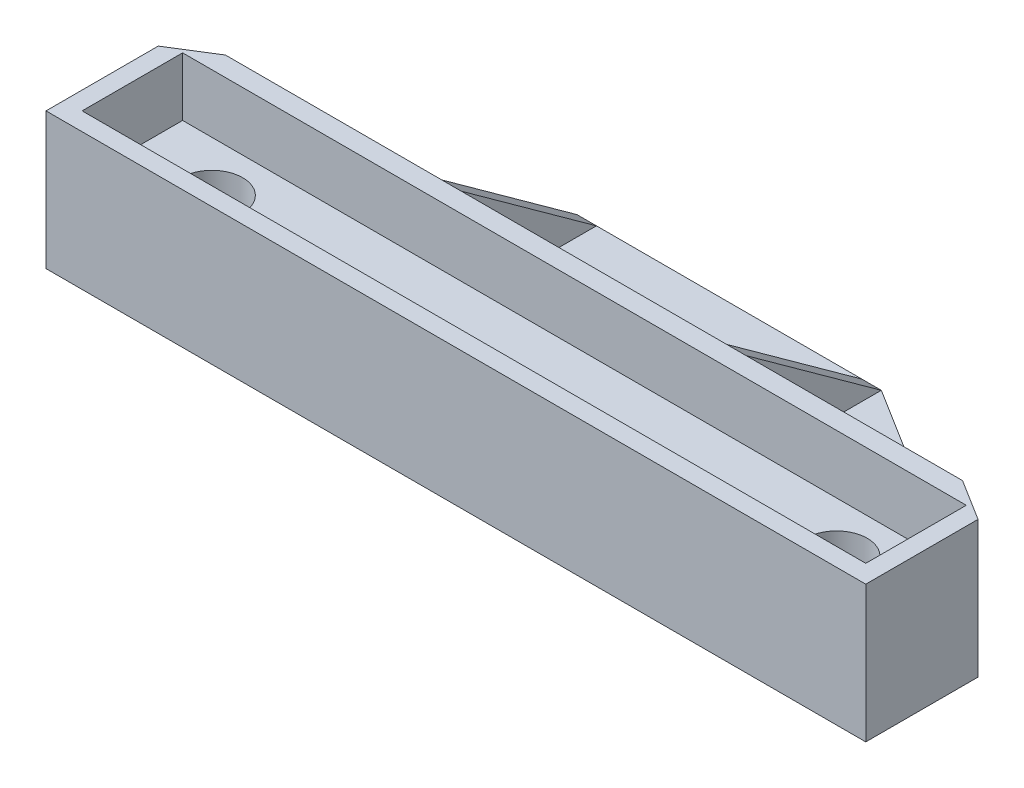
ISO-10303-21;
HEADER;
FILE_DESCRIPTION(('STEP AP214'),'2;1');
FILE_NAME('part.step','',(''),(''),'','','');
FILE_SCHEMA(('AUTOMOTIVE_DESIGN { 1 0 10303 214 1 1 1 1 }'));
ENDSEC;
DATA;
#1=APPLICATION_CONTEXT('core data for automotive mechanical design processes');
#2=APPLICATION_PROTOCOL_DEFINITION('international standard','automotive_design',2000,#1);
#3=PRODUCT_CONTEXT('',#1,'mechanical');
#4=PRODUCT('Part','Part','',(#3));
#5=PRODUCT_RELATED_PRODUCT_CATEGORY('part','',(#4));
#6=PRODUCT_DEFINITION_FORMATION('','',#4);
#7=PRODUCT_DEFINITION_CONTEXT('part definition',#1,'design');
#8=PRODUCT_DEFINITION('design','',#6,#7);
#9=PRODUCT_DEFINITION_SHAPE('','',#8);
#10=(LENGTH_UNIT() NAMED_UNIT(*) SI_UNIT(.MILLI.,.METRE.));
#11=(NAMED_UNIT(*) PLANE_ANGLE_UNIT() SI_UNIT($,.RADIAN.));
#12=(NAMED_UNIT(*) SI_UNIT($,.STERADIAN.) SOLID_ANGLE_UNIT());
#13=UNCERTAINTY_MEASURE_WITH_UNIT(LENGTH_MEASURE(1.E-05),#10,'distance_accuracy_value','');
#14=(GEOMETRIC_REPRESENTATION_CONTEXT(3) GLOBAL_UNCERTAINTY_ASSIGNED_CONTEXT((#13)) GLOBAL_UNIT_ASSIGNED_CONTEXT((#10,
#11,#12)) REPRESENTATION_CONTEXT('',''));
#15=CARTESIAN_POINT('',(0.,0.,0.));
#16=DIRECTION('',(0.,0.,1.));
#17=DIRECTION('',(1.,0.,0.));
#18=AXIS2_PLACEMENT_3D('',#15,#16,#17);
#19=CARTESIAN_POINT('',(-16.,7.,-3.49999999993634));
#20=DIRECTION('',(0.,-1.,0.));
#21=DIRECTION('',(0.,0.,-1.));
#22=AXIS2_PLACEMENT_3D('',#19,#20,#21);
#23=CYLINDRICAL_SURFACE('',#22,1.575);
#24=CARTESIAN_POINT('',(-16.,0.,-3.49999999993634));
#25=DIRECTION('',(0.,-1.,0.));
#26=DIRECTION('',(0.,0.,1.));
#27=AXIS2_PLACEMENT_3D('',#24,#25,#26);
#28=CIRCLE('',#27,1.575);
#29=CARTESIAN_POINT('',(-16.,0.,-1.92499999993634));
#30=VERTEX_POINT('',#29);
#31=EDGE_CURVE('E293',#30,#30,#28,.T.);
#32=ORIENTED_EDGE('',*,*,#31,.T.);
#33=EDGE_LOOP('',(#32));
#34=FACE_BOUND('',#33,.T.);
#35=CARTESIAN_POINT('',(-16.,4.,-3.49999999993634));
#36=DIRECTION('',(0.,1.,0.));
#37=DIRECTION('',(0.,0.,1.));
#38=AXIS2_PLACEMENT_3D('',#35,#36,#37);
#39=CIRCLE('',#38,1.575);
#40=CARTESIAN_POINT('',(-16.,4.,-1.92499999993634));
#41=VERTEX_POINT('',#40);
#42=EDGE_CURVE('E289',#41,#41,#39,.F.);
#43=ORIENTED_EDGE('',*,*,#42,.F.);
#44=EDGE_LOOP('',(#43));
#45=FACE_BOUND('',#44,.T.);
#46=ADVANCED_FACE('F45',(#34,#45),#23,.F.);
#47=CARTESIAN_POINT('',(16.,7.,-3.49999999993633));
#48=DIRECTION('',(0.,-1.,0.));
#49=DIRECTION('',(0.,0.,-1.));
#50=AXIS2_PLACEMENT_3D('',#47,#48,#49);
#51=CYLINDRICAL_SURFACE('',#50,1.575);
#52=CARTESIAN_POINT('',(16.,0.,-3.49999999993633));
#53=DIRECTION('',(0.,-1.,0.));
#54=DIRECTION('',(0.,0.,-1.));
#55=AXIS2_PLACEMENT_3D('',#52,#53,#54);
#56=CIRCLE('',#55,1.575);
#57=CARTESIAN_POINT('',(16.,0.,-5.07499999993633));
#58=VERTEX_POINT('',#57);
#59=EDGE_CURVE('E294',#58,#58,#56,.T.);
#60=ORIENTED_EDGE('',*,*,#59,.T.);
#61=EDGE_LOOP('',(#60));
#62=FACE_BOUND('',#61,.T.);
#63=CARTESIAN_POINT('',(16.,4.,-3.49999999993633));
#64=DIRECTION('',(0.,1.,0.));
#65=DIRECTION('',(0.,0.,1.));
#66=AXIS2_PLACEMENT_3D('',#63,#64,#65);
#67=CIRCLE('',#66,1.575);
#68=CARTESIAN_POINT('',(16.,4.,-1.92499999993633));
#69=VERTEX_POINT('',#68);
#70=EDGE_CURVE('E279',#69,#69,#67,.F.);
#71=ORIENTED_EDGE('',*,*,#70,.F.);
#72=EDGE_LOOP('',(#71));
#73=FACE_BOUND('',#72,.T.);
#74=ADVANCED_FACE('F403',(#62,#73),#51,.F.);
#75=CARTESIAN_POINT('',(21.,7.,-5.75));
#76=DIRECTION('',(-1.,0.,0.));
#77=DIRECTION('',(0.,0.,1.));
#78=AXIS2_PLACEMENT_3D('',#75,#76,#77);
#79=PLANE('',#78);
#80=DIRECTION('',(0.,0.,-1.));
#81=VECTOR('',#80,1.);
#82=CARTESIAN_POINT('',(21.,0.,-5.75));
#83=LINE('',#82,#81);
#84=CARTESIAN_POINT('',(21.,0.,0.));
#85=VERTEX_POINT('',#84);
#86=CARTESIAN_POINT('',(21.,0.,-5.75));
#87=VERTEX_POINT('',#86);
#88=EDGE_CURVE('E298',#85,#87,#83,.T.);
#89=ORIENTED_EDGE('',*,*,#88,.T.);
#90=DIRECTION('',(0.,-1.,0.));
#91=VECTOR('',#90,1.);
#92=CARTESIAN_POINT('',(21.,7.,-5.75));
#93=LINE('',#92,#91);
#94=CARTESIAN_POINT('',(21.,7.,-5.75));
#95=VERTEX_POINT('',#94);
#96=EDGE_CURVE('E345',#95,#87,#93,.T.);
#97=ORIENTED_EDGE('',*,*,#96,.F.);
#98=DIRECTION('',(0.,0.,-1.));
#99=VECTOR('',#98,1.);
#100=CARTESIAN_POINT('',(21.,7.,-5.75));
#101=LINE('',#100,#99);
#102=CARTESIAN_POINT('',(21.,7.,0.));
#103=VERTEX_POINT('',#102);
#104=EDGE_CURVE('E302',#103,#95,#101,.T.);
#105=ORIENTED_EDGE('',*,*,#104,.F.);
#106=DIRECTION('',(0.,-1.,0.));
#107=VECTOR('',#106,1.);
#108=CARTESIAN_POINT('',(21.,7.,0.));
#109=LINE('',#108,#107);
#110=EDGE_CURVE('E320',#103,#85,#109,.T.);
#111=ORIENTED_EDGE('',*,*,#110,.T.);
#112=EDGE_LOOP('',(#89,#97,#105,#111));
#113=FACE_BOUND('',#112,.T.);
#114=ADVANCED_FACE('F409',(#113),#79,.F.);
#115=CARTESIAN_POINT('',(21.,7.,-5.75));
#116=DIRECTION('',(-0.529919264233528,0.,0.848048096156224));
#117=DIRECTION('',(0.848048096156224,0.,0.529919264233528));
#118=AXIS2_PLACEMENT_3D('',#115,#116,#117);
#119=PLANE('',#118);
#120=DIRECTION('',(-0.848048096156395,0.,-0.529919264233254));
#121=VECTOR('',#120,1.);
#122=CARTESIAN_POINT('',(7.79724013561682,2.,-13.9999999998727));
#123=LINE('',#122,#121);
#124=CARTESIAN_POINT('',(17.2792222201838,2.,-8.07499999987266));
#125=VERTEX_POINT('',#124);
#126=CARTESIAN_POINT('',(7.79724013561682,2.,-13.9999999998727));
#127=VERTEX_POINT('',#126);
#128=EDGE_CURVE('E184',#125,#127,#123,.T.);
#129=ORIENTED_EDGE('',*,*,#128,.F.);
#130=DIRECTION('',(-0.749337346632538,-0.468237942152119,-0.468237942152125));
#131=VECTOR('',#130,1.);
#132=CARTESIAN_POINT('',(21.9385723739609,4.91148511091008,-5.16351488896254));
#133=LINE('',#132,#131);
#134=CARTESIAN_POINT('',(18.8795567492247,2.99999999999999,-7.07499999987266));
#135=VERTEX_POINT('',#134);
#136=EDGE_CURVE('E55',#125,#135,#133,.F.);
#137=ORIENTED_EDGE('',*,*,#136,.T.);
#138=DIRECTION('',(0.,1.,0.));
#139=VECTOR('',#138,1.);
#140=CARTESIAN_POINT('',(18.8795567492247,2.,-7.07499999987266));
#141=LINE('',#140,#139);
#142=CARTESIAN_POINT('',(18.8795567492247,7.,-7.07499999987266));
#143=VERTEX_POINT('',#142);
#144=EDGE_CURVE('E232',#135,#143,#141,.T.);
#145=ORIENTED_EDGE('',*,*,#144,.T.);
#146=DIRECTION('',(-0.848048096156224,0.,-0.529919264233528));
#147=VECTOR('',#146,1.);
#148=CARTESIAN_POINT('',(21.,7.,-5.75));
#149=LINE('',#148,#147);
#150=EDGE_CURVE('E306',#95,#143,#149,.T.);
#151=ORIENTED_EDGE('',*,*,#150,.F.);
#152=ORIENTED_EDGE('',*,*,#96,.T.);
#153=DIRECTION('',(-0.848048096156224,0.,-0.529919264233528));
#154=VECTOR('',#153,1.);
#155=CARTESIAN_POINT('',(21.,0.,-5.75));
#156=LINE('',#155,#154);
#157=CARTESIAN_POINT('',(7.79724013561683,0.,-13.9999999998727));
#158=VERTEX_POINT('',#157);
#159=EDGE_CURVE('E236',#87,#158,#156,.T.);
#160=ORIENTED_EDGE('',*,*,#159,.T.);
#161=DIRECTION('',(0.,-1.,0.));
#162=VECTOR('',#161,1.);
#163=CARTESIAN_POINT('',(7.79724013561683,7.,-13.9999999998727));
#164=LINE('',#163,#162);
#165=EDGE_CURVE('E219',#127,#158,#164,.T.);
#166=ORIENTED_EDGE('',*,*,#165,.F.);
#167=EDGE_LOOP('',(#129,#137,#145,#151,#152,#160,#166));
#168=FACE_BOUND('',#167,.T.);
#169=ADVANCED_FACE('F234',(#168),#119,.F.);
#170=CARTESIAN_POINT('',(-21.,7.,-5.75));
#171=DIRECTION('',(0.529919264233528,0.,0.848048096156224));
#172=DIRECTION('',(0.848048096156224,0.,-0.529919264233528));
#173=AXIS2_PLACEMENT_3D('',#170,#171,#172);
#174=PLANE('',#173);
#175=DIRECTION('',(-0.848048096156224,0.,0.529919264233528));
#176=VECTOR('',#175,1.);
#177=CARTESIAN_POINT('',(-21.,7.,-5.75));
#178=LINE('',#177,#176);
#179=CARTESIAN_POINT('',(-18.8795567492247,7.,-7.07499999987266));
#180=VERTEX_POINT('',#179);
#181=CARTESIAN_POINT('',(-21.,7.,-5.75));
#182=VERTEX_POINT('',#181);
#183=EDGE_CURVE('E311',#180,#182,#178,.T.);
#184=ORIENTED_EDGE('',*,*,#183,.F.);
#185=DIRECTION('',(0.,1.,0.));
#186=VECTOR('',#185,1.);
#187=CARTESIAN_POINT('',(-18.8795567492247,2.,-7.07499999987266));
#188=LINE('',#187,#186);
#189=CARTESIAN_POINT('',(-18.8795567492247,2.99999999999999,-7.07499999987266));
#190=VERTEX_POINT('',#189);
#191=EDGE_CURVE('E490',#190,#180,#188,.T.);
#192=ORIENTED_EDGE('',*,*,#191,.F.);
#193=DIRECTION('',(-0.749337346632538,0.468237942152119,0.468237942152125));
#194=VECTOR('',#193,1.);
#195=CARTESIAN_POINT('',(-21.9385723739609,4.91148511091008,-5.16351488896254));
#196=LINE('',#195,#194);
#197=CARTESIAN_POINT('',(-17.2792222201838,2.,-8.07499999987266));
#198=VERTEX_POINT('',#197);
#199=EDGE_CURVE('E11',#190,#198,#196,.F.);
#200=ORIENTED_EDGE('',*,*,#199,.T.);
#201=DIRECTION('',(-0.848048096156395,0.,0.529919264233254));
#202=VECTOR('',#201,1.);
#203=CARTESIAN_POINT('',(-7.79724013561682,2.,-13.9999999998727));
#204=LINE('',#203,#202);
#205=CARTESIAN_POINT('',(-7.79724013561682,2.,-13.9999999998727));
#206=VERTEX_POINT('',#205);
#207=EDGE_CURVE('E483',#206,#198,#204,.T.);
#208=ORIENTED_EDGE('',*,*,#207,.F.);
#209=DIRECTION('',(0.,-1.,0.));
#210=VECTOR('',#209,1.);
#211=CARTESIAN_POINT('',(-7.79724013561683,7.,-13.9999999998727));
#212=LINE('',#211,#210);
#213=CARTESIAN_POINT('',(-7.79724013561683,0.,-13.9999999998727));
#214=VERTEX_POINT('',#213);
#215=EDGE_CURVE('E240',#206,#214,#212,.T.);
#216=ORIENTED_EDGE('',*,*,#215,.T.);
#217=DIRECTION('',(-0.848048096156224,0.,0.529919264233528));
#218=VECTOR('',#217,1.);
#219=CARTESIAN_POINT('',(-21.,0.,-5.75));
#220=LINE('',#219,#218);
#221=CARTESIAN_POINT('',(-21.,0.,-5.75));
#222=VERTEX_POINT('',#221);
#223=EDGE_CURVE('E326',#214,#222,#220,.T.);
#224=ORIENTED_EDGE('',*,*,#223,.T.);
#225=DIRECTION('',(0.,-1.,0.));
#226=VECTOR('',#225,1.);
#227=CARTESIAN_POINT('',(-21.,7.,-5.75));
#228=LINE('',#227,#226);
#229=EDGE_CURVE('E341',#182,#222,#228,.T.);
#230=ORIENTED_EDGE('',*,*,#229,.F.);
#231=EDGE_LOOP('',(#184,#192,#200,#208,#216,#224,#230));
#232=FACE_BOUND('',#231,.T.);
#233=ADVANCED_FACE('F431',(#232),#174,.F.);
#234=CARTESIAN_POINT('',(-21.,7.,-5.75));
#235=DIRECTION('',(1.,0.,0.));
#236=DIRECTION('',(0.,0.,-1.));
#237=AXIS2_PLACEMENT_3D('',#234,#235,#236);
#238=PLANE('',#237);
#239=DIRECTION('',(0.,0.,1.));
#240=VECTOR('',#239,1.);
#241=CARTESIAN_POINT('',(-21.,0.,-5.75));
#242=LINE('',#241,#240);
#243=CARTESIAN_POINT('',(-21.,0.,0.));
#244=VERTEX_POINT('',#243);
#245=EDGE_CURVE('E329',#222,#244,#242,.T.);
#246=ORIENTED_EDGE('',*,*,#245,.T.);
#247=DIRECTION('',(0.,-1.,0.));
#248=VECTOR('',#247,1.);
#249=CARTESIAN_POINT('',(-21.,7.,0.));
#250=LINE('',#249,#248);
#251=CARTESIAN_POINT('',(-21.,7.,0.));
#252=VERTEX_POINT('',#251);
#253=EDGE_CURVE('E337',#252,#244,#250,.T.);
#254=ORIENTED_EDGE('',*,*,#253,.F.);
#255=DIRECTION('',(0.,0.,1.));
#256=VECTOR('',#255,1.);
#257=CARTESIAN_POINT('',(-21.,7.,-5.75));
#258=LINE('',#257,#256);
#259=EDGE_CURVE('E314',#182,#252,#258,.T.);
#260=ORIENTED_EDGE('',*,*,#259,.F.);
#261=ORIENTED_EDGE('',*,*,#229,.T.);
#262=EDGE_LOOP('',(#246,#254,#260,#261));
#263=FACE_BOUND('',#262,.T.);
#264=ADVANCED_FACE('F427',(#263),#238,.F.);
#265=CARTESIAN_POINT('',(-21.,7.,0.));
#266=DIRECTION('',(0.,0.,-1.));
#267=DIRECTION('',(-1.,0.,0.));
#268=AXIS2_PLACEMENT_3D('',#265,#266,#267);
#269=PLANE('',#268);
#270=DIRECTION('',(1.,0.,0.));
#271=VECTOR('',#270,1.);
#272=CARTESIAN_POINT('',(-21.,0.,0.));
#273=LINE('',#272,#271);
#274=EDGE_CURVE('E307',#244,#85,#273,.T.);
#275=ORIENTED_EDGE('',*,*,#274,.T.);
#276=ORIENTED_EDGE('',*,*,#110,.F.);
#277=DIRECTION('',(1.,0.,0.));
#278=VECTOR('',#277,1.);
#279=CARTESIAN_POINT('',(-21.,7.,0.));
#280=LINE('',#279,#278);
#281=EDGE_CURVE('E317',#252,#103,#280,.T.);
#282=ORIENTED_EDGE('',*,*,#281,.F.);
#283=ORIENTED_EDGE('',*,*,#253,.T.);
#284=EDGE_LOOP('',(#275,#276,#282,#283));
#285=FACE_BOUND('',#284,.T.);
#286=ADVANCED_FACE('F419',(#285),#269,.F.);
#287=CARTESIAN_POINT('',(0.,7.,0.));
#288=DIRECTION('',(0.,1.,0.));
#289=DIRECTION('',(0.,0.,1.));
#290=AXIS2_PLACEMENT_3D('',#287,#288,#289);
#291=PLANE('',#290);
#292=DIRECTION('',(-1.,0.,0.));
#293=VECTOR('',#292,1.);
#294=CARTESIAN_POINT('',(21.,7.,-7.07499999987266));
#295=LINE('',#294,#293);
#296=CARTESIAN_POINT('',(-6.79724013561682,7.,-7.07499999987266));
#297=VERTEX_POINT('',#296);
#298=CARTESIAN_POINT('',(-7.79724013561682,7.,-7.07499999987266));
#299=VERTEX_POINT('',#298);
#300=EDGE_CURVE('E225',#297,#299,#295,.T.);
#301=ORIENTED_EDGE('',*,*,#300,.T.);
#302=DIRECTION('',(1.,0.,0.));
#303=VECTOR('',#302,1.);
#304=CARTESIAN_POINT('',(-18.8795567492247,7.,-7.07499999987266));
#305=LINE('',#304,#303);
#306=EDGE_CURVE('E469',#180,#299,#305,.T.);
#307=ORIENTED_EDGE('',*,*,#306,.F.);
#308=ORIENTED_EDGE('',*,*,#183,.T.);
#309=ORIENTED_EDGE('',*,*,#259,.T.);
#310=ORIENTED_EDGE('',*,*,#281,.T.);
#311=ORIENTED_EDGE('',*,*,#104,.T.);
#312=ORIENTED_EDGE('',*,*,#150,.T.);
#313=DIRECTION('',(1.,0.,0.));
#314=VECTOR('',#313,1.);
#315=CARTESIAN_POINT('',(18.8795567492247,7.,-7.07499999987266));
#316=LINE('',#315,#314);
#317=CARTESIAN_POINT('',(7.79724013561682,7.,-7.07499999987266));
#318=VERTEX_POINT('',#317);
#319=EDGE_CURVE('E194',#318,#143,#316,.T.);
#320=ORIENTED_EDGE('',*,*,#319,.F.);
#321=CARTESIAN_POINT('',(6.79724013561682,7.,-7.07499999987266));
#322=VERTEX_POINT('',#321);
#323=EDGE_CURVE('E207',#318,#322,#295,.T.);
#324=ORIENTED_EDGE('',*,*,#323,.T.);
#325=DIRECTION('',(1.,0.,0.));
#326=VECTOR('',#325,1.);
#327=CARTESIAN_POINT('',(6.79724013561682,7.,-7.07499999987266));
#328=LINE('',#327,#326);
#329=EDGE_CURVE('E464',#297,#322,#328,.T.);
#330=ORIENTED_EDGE('',*,*,#329,.F.);
#331=EDGE_LOOP('',(#301,#307,#308,#309,#310,#311,#312,#320,#324,#330));
#332=FACE_BOUND('',#331,.T.);
#333=DIRECTION('',(0.,0.,1.));
#334=VECTOR('',#333,1.);
#335=CARTESIAN_POINT('',(-20.075,7.,-6.07499999987266));
#336=LINE('',#335,#334);
#337=CARTESIAN_POINT('',(-20.075,7.,-6.07499999987266));
#338=VERTEX_POINT('',#337);
#339=CARTESIAN_POINT('',(-20.075,7.,-0.924999999872669));
#340=VERTEX_POINT('',#339);
#341=EDGE_CURVE('E239',#338,#340,#336,.T.);
#342=ORIENTED_EDGE('',*,*,#341,.F.);
#343=DIRECTION('',(1.,0.,0.));
#344=VECTOR('',#343,1.);
#345=CARTESIAN_POINT('',(-20.075,7.,-6.07499999987266));
#346=LINE('',#345,#344);
#347=CARTESIAN_POINT('',(20.075,7.,-6.07499999987266));
#348=VERTEX_POINT('',#347);
#349=EDGE_CURVE('E255',#338,#348,#346,.T.);
#350=ORIENTED_EDGE('',*,*,#349,.T.);
#351=DIRECTION('',(0.,0.,1.));
#352=VECTOR('',#351,1.);
#353=CARTESIAN_POINT('',(20.075,7.,-6.07499999987266));
#354=LINE('',#353,#352);
#355=CARTESIAN_POINT('',(20.075,7.,-0.924999999872669));
#356=VERTEX_POINT('',#355);
#357=EDGE_CURVE('E269',#348,#356,#354,.T.);
#358=ORIENTED_EDGE('',*,*,#357,.T.);
#359=DIRECTION('',(1.,0.,0.));
#360=VECTOR('',#359,1.);
#361=CARTESIAN_POINT('',(-20.075,7.,-0.924999999872669));
#362=LINE('',#361,#360);
#363=EDGE_CURVE('E244',#340,#356,#362,.T.);
#364=ORIENTED_EDGE('',*,*,#363,.F.);
#365=EDGE_LOOP('',(#342,#350,#358,#364));
#366=FACE_BOUND('',#365,.T.);
#367=ADVANCED_FACE('F415',(#332,#366),#291,.T.);
#368=CARTESIAN_POINT('',(0.,0.,0.));
#369=DIRECTION('',(0.,1.,0.));
#370=DIRECTION('',(0.,0.,1.));
#371=AXIS2_PLACEMENT_3D('',#368,#369,#370);
#372=PLANE('',#371);
#373=ORIENTED_EDGE('',*,*,#59,.F.);
#374=EDGE_LOOP('',(#373));
#375=FACE_BOUND('',#374,.T.);
#376=ORIENTED_EDGE('',*,*,#31,.F.);
#377=EDGE_LOOP('',(#376));
#378=FACE_BOUND('',#377,.T.);
#379=ORIENTED_EDGE('',*,*,#88,.F.);
#380=ORIENTED_EDGE('',*,*,#274,.F.);
#381=ORIENTED_EDGE('',*,*,#245,.F.);
#382=ORIENTED_EDGE('',*,*,#223,.F.);
#383=DIRECTION('',(-1.,0.,0.));
#384=VECTOR('',#383,1.);
#385=CARTESIAN_POINT('',(7.79724013561683,0.,-13.9999999998727));
#386=LINE('',#385,#384);
#387=EDGE_CURVE('E246',#158,#214,#386,.T.);
#388=ORIENTED_EDGE('',*,*,#387,.F.);
#389=ORIENTED_EDGE('',*,*,#159,.F.);
#390=EDGE_LOOP('',(#379,#380,#381,#382,#388,#389));
#391=FACE_BOUND('',#390,.T.);
#392=ADVANCED_FACE('F418',(#375,#378,#391),#372,.F.);
#393=CARTESIAN_POINT('',(0.,4.,0.));
#394=DIRECTION('',(0.,1.,0.));
#395=DIRECTION('',(0.,0.,1.));
#396=AXIS2_PLACEMENT_3D('',#393,#394,#395);
#397=PLANE('',#396);
#398=DIRECTION('',(0.,0.,1.));
#399=VECTOR('',#398,1.);
#400=CARTESIAN_POINT('',(-20.075,4.,-6.07499999987266));
#401=LINE('',#400,#399);
#402=CARTESIAN_POINT('',(-20.075,4.,-6.07499999987266));
#403=VERTEX_POINT('',#402);
#404=CARTESIAN_POINT('',(-20.075,4.,-0.924999999872669));
#405=VERTEX_POINT('',#404);
#406=EDGE_CURVE('E250',#403,#405,#401,.T.);
#407=ORIENTED_EDGE('',*,*,#406,.T.);
#408=DIRECTION('',(1.,0.,0.));
#409=VECTOR('',#408,1.);
#410=CARTESIAN_POINT('',(-20.075,4.,-0.924999999872669));
#411=LINE('',#410,#409);
#412=CARTESIAN_POINT('',(20.075,4.,-0.924999999872669));
#413=VERTEX_POINT('',#412);
#414=EDGE_CURVE('E254',#405,#413,#411,.T.);
#415=ORIENTED_EDGE('',*,*,#414,.T.);
#416=DIRECTION('',(0.,0.,1.));
#417=VECTOR('',#416,1.);
#418=CARTESIAN_POINT('',(20.075,4.,-6.07499999987266));
#419=LINE('',#418,#417);
#420=CARTESIAN_POINT('',(20.075,4.,-6.07499999987266));
#421=VERTEX_POINT('',#420);
#422=EDGE_CURVE('E259',#421,#413,#419,.T.);
#423=ORIENTED_EDGE('',*,*,#422,.F.);
#424=DIRECTION('',(1.,0.,0.));
#425=VECTOR('',#424,1.);
#426=CARTESIAN_POINT('',(-20.075,4.,-6.07499999987266));
#427=LINE('',#426,#425);
#428=EDGE_CURVE('E262',#403,#421,#427,.T.);
#429=ORIENTED_EDGE('',*,*,#428,.F.);
#430=EDGE_LOOP('',(#407,#415,#423,#429));
#431=FACE_BOUND('',#430,.T.);
#432=ORIENTED_EDGE('',*,*,#70,.T.);
#433=EDGE_LOOP('',(#432));
#434=FACE_BOUND('',#433,.T.);
#435=ORIENTED_EDGE('',*,*,#42,.T.);
#436=EDGE_LOOP('',(#435));
#437=FACE_BOUND('',#436,.T.);
#438=ADVANCED_FACE('F423',(#431,#434,#437),#397,.T.);
#439=CARTESIAN_POINT('',(-20.075,4.,-6.07499999987266));
#440=DIRECTION('',(-1.,0.,0.));
#441=DIRECTION('',(0.,0.,1.));
#442=AXIS2_PLACEMENT_3D('',#439,#440,#441);
#443=PLANE('',#442);
#444=ORIENTED_EDGE('',*,*,#341,.T.);
#445=DIRECTION('',(0.,1.,0.));
#446=VECTOR('',#445,1.);
#447=CARTESIAN_POINT('',(-20.075,4.,-0.924999999872669));
#448=LINE('',#447,#446);
#449=EDGE_CURVE('E264',#405,#340,#448,.T.);
#450=ORIENTED_EDGE('',*,*,#449,.F.);
#451=ORIENTED_EDGE('',*,*,#406,.F.);
#452=DIRECTION('',(0.,1.,0.));
#453=VECTOR('',#452,1.);
#454=CARTESIAN_POINT('',(-20.075,4.,-6.07499999987266));
#455=LINE('',#454,#453);
#456=EDGE_CURVE('E276',#403,#338,#455,.T.);
#457=ORIENTED_EDGE('',*,*,#456,.T.);
#458=EDGE_LOOP('',(#444,#450,#451,#457));
#459=FACE_BOUND('',#458,.T.);
#460=ADVANCED_FACE('F719',(#459),#443,.F.);
#461=CARTESIAN_POINT('',(-20.075,4.,-6.07499999987266));
#462=DIRECTION('',(0.,0.,1.));
#463=DIRECTION('',(1.,0.,0.));
#464=AXIS2_PLACEMENT_3D('',#461,#462,#463);
#465=PLANE('',#464);
#466=ORIENTED_EDGE('',*,*,#349,.F.);
#467=ORIENTED_EDGE('',*,*,#456,.F.);
#468=ORIENTED_EDGE('',*,*,#428,.T.);
#469=DIRECTION('',(0.,1.,0.));
#470=VECTOR('',#469,1.);
#471=CARTESIAN_POINT('',(20.075,4.,-6.07499999987266));
#472=LINE('',#471,#470);
#473=EDGE_CURVE('E280',#421,#348,#472,.T.);
#474=ORIENTED_EDGE('',*,*,#473,.T.);
#475=EDGE_LOOP('',(#466,#467,#468,#474));
#476=FACE_BOUND('',#475,.T.);
#477=ADVANCED_FACE('F708',(#476),#465,.T.);
#478=CARTESIAN_POINT('',(20.075,4.,-6.07499999987266));
#479=DIRECTION('',(-1.,0.,0.));
#480=DIRECTION('',(0.,0.,1.));
#481=AXIS2_PLACEMENT_3D('',#478,#479,#480);
#482=PLANE('',#481);
#483=ORIENTED_EDGE('',*,*,#357,.F.);
#484=ORIENTED_EDGE('',*,*,#473,.F.);
#485=ORIENTED_EDGE('',*,*,#422,.T.);
#486=DIRECTION('',(0.,1.,0.));
#487=VECTOR('',#486,1.);
#488=CARTESIAN_POINT('',(20.075,4.,-0.924999999872669));
#489=LINE('',#488,#487);
#490=EDGE_CURVE('E283',#413,#356,#489,.T.);
#491=ORIENTED_EDGE('',*,*,#490,.T.);
#492=EDGE_LOOP('',(#483,#484,#485,#491));
#493=FACE_BOUND('',#492,.T.);
#494=ADVANCED_FACE('F697',(#493),#482,.T.);
#495=CARTESIAN_POINT('',(-20.075,4.,-0.924999999872669));
#496=DIRECTION('',(0.,0.,1.));
#497=DIRECTION('',(1.,0.,0.));
#498=AXIS2_PLACEMENT_3D('',#495,#496,#497);
#499=PLANE('',#498);
#500=ORIENTED_EDGE('',*,*,#363,.T.);
#501=ORIENTED_EDGE('',*,*,#490,.F.);
#502=ORIENTED_EDGE('',*,*,#414,.F.);
#503=ORIENTED_EDGE('',*,*,#449,.T.);
#504=EDGE_LOOP('',(#500,#501,#502,#503));
#505=FACE_BOUND('',#504,.T.);
#506=ADVANCED_FACE('F674',(#505),#499,.F.);
#507=CARTESIAN_POINT('',(7.79724013561683,7.,-13.9999999998727));
#508=DIRECTION('',(0.,0.,1.));
#509=DIRECTION('',(1.,0.,0.));
#510=AXIS2_PLACEMENT_3D('',#507,#508,#509);
#511=PLANE('',#510);
#512=ORIENTED_EDGE('',*,*,#215,.F.);
#513=DIRECTION('',(-1.,0.,0.));
#514=VECTOR('',#513,1.);
#515=CARTESIAN_POINT('',(21.,2.,-13.9999999998727));
#516=LINE('',#515,#514);
#517=CARTESIAN_POINT('',(-6.79724013561682,2.,-13.9999999998727));
#518=VERTEX_POINT('',#517);
#519=EDGE_CURVE('E226',#518,#206,#516,.T.);
#520=ORIENTED_EDGE('',*,*,#519,.F.);
#521=DIRECTION('',(-1.,0.,0.));
#522=VECTOR('',#521,1.);
#523=CARTESIAN_POINT('',(-6.79724013561682,2.,-13.9999999998727));
#524=LINE('',#523,#522);
#525=CARTESIAN_POINT('',(6.79724013561682,2.,-13.9999999998727));
#526=VERTEX_POINT('',#525);
#527=EDGE_CURVE('E223',#526,#518,#524,.T.);
#528=ORIENTED_EDGE('',*,*,#527,.F.);
#529=EDGE_CURVE('E204',#127,#526,#516,.T.);
#530=ORIENTED_EDGE('',*,*,#529,.F.);
#531=ORIENTED_EDGE('',*,*,#165,.T.);
#532=ORIENTED_EDGE('',*,*,#387,.T.);
#533=EDGE_LOOP('',(#512,#520,#528,#530,#531,#532));
#534=FACE_BOUND('',#533,.T.);
#535=ADVANCED_FACE('F217',(#534),#511,.F.);
#536=CARTESIAN_POINT('',(6.79724013561682,2.,-7.07499999987266));
#537=DIRECTION('',(0.,0.,1.));
#538=DIRECTION('',(1.,0.,0.));
#539=AXIS2_PLACEMENT_3D('',#536,#537,#538);
#540=PLANE('',#539);
#541=DIRECTION('',(0.,1.,0.));
#542=VECTOR('',#541,1.);
#543=CARTESIAN_POINT('',(6.79724013561682,2.,-7.07499999987266));
#544=LINE('',#543,#542);
#545=CARTESIAN_POINT('',(6.79724013561682,2.99999999999999,-7.07499999987266));
#546=VERTEX_POINT('',#545);
#547=EDGE_CURVE('E458',#546,#322,#544,.T.);
#548=ORIENTED_EDGE('',*,*,#547,.F.);
#549=DIRECTION('',(-1.,0.,0.));
#550=VECTOR('',#549,1.);
#551=CARTESIAN_POINT('',(-6.79724013561682,2.99999999999999,-7.07499999987266));
#552=LINE('',#551,#550);
#553=CARTESIAN_POINT('',(-6.79724013561682,2.99999999999999,-7.07499999987266));
#554=VERTEX_POINT('',#553);
#555=EDGE_CURVE('E62',#546,#554,#552,.T.);
#556=ORIENTED_EDGE('',*,*,#555,.T.);
#557=DIRECTION('',(0.,1.,0.));
#558=VECTOR('',#557,1.);
#559=CARTESIAN_POINT('',(-6.79724013561682,2.,-7.07499999987266));
#560=LINE('',#559,#558);
#561=EDGE_CURVE('E456',#554,#297,#560,.T.);
#562=ORIENTED_EDGE('',*,*,#561,.T.);
#563=ORIENTED_EDGE('',*,*,#329,.T.);
#564=EDGE_LOOP('',(#548,#556,#562,#563));
#565=FACE_BOUND('',#564,.T.);
#566=ADVANCED_FACE('F514',(#565),#540,.F.);
#567=CARTESIAN_POINT('',(-6.79724013561682,2.,-7.07499999987266));
#568=DIRECTION('',(-1.,0.,0.));
#569=DIRECTION('',(0.,0.,1.));
#570=AXIS2_PLACEMENT_3D('',#567,#568,#569);
#571=PLANE('',#570);
#572=ORIENTED_EDGE('',*,*,#561,.F.);
#573=DIRECTION('',(0.,0.707106781186543,0.707106781186552));
#574=VECTOR('',#573,1.);
#575=CARTESIAN_POINT('',(-6.79724013561682,2.,-8.07499999987266));
#576=LINE('',#575,#574);
#577=CARTESIAN_POINT('',(-6.79724013561682,2.,-8.07499999987266));
#578=VERTEX_POINT('',#577);
#579=EDGE_CURVE('E376',#554,#578,#576,.F.);
#580=ORIENTED_EDGE('',*,*,#579,.T.);
#581=DIRECTION('',(0.,0.,1.));
#582=VECTOR('',#581,1.);
#583=CARTESIAN_POINT('',(-6.79724013561682,2.,-7.07499999987266));
#584=LINE('',#583,#582);
#585=EDGE_CURVE('E462',#518,#578,#584,.T.);
#586=ORIENTED_EDGE('',*,*,#585,.F.);
#587=DIRECTION('',(0.,0.585383683581828,0.810756401760831));
#588=VECTOR('',#587,1.);
#589=CARTESIAN_POINT('',(-6.79724013561682,5.28662971498086,-9.44801784462418));
#590=LINE('',#589,#588);
#591=EDGE_CURVE('E481',#518,#297,#590,.T.);
#592=ORIENTED_EDGE('',*,*,#591,.T.);
#593=EDGE_LOOP('',(#572,#580,#586,#592));
#594=FACE_BOUND('',#593,.T.);
#595=ADVANCED_FACE('F519',(#594),#571,.F.);
#596=CARTESIAN_POINT('',(6.79724013561682,2.,-13.9999999998727));
#597=DIRECTION('',(1.,0.,0.));
#598=DIRECTION('',(0.,0.,-1.));
#599=AXIS2_PLACEMENT_3D('',#596,#597,#598);
#600=PLANE('',#599);
#601=DIRECTION('',(0.,0.,-1.));
#602=VECTOR('',#601,1.);
#603=CARTESIAN_POINT('',(6.79724013561682,2.,-13.9999999998727));
#604=LINE('',#603,#602);
#605=CARTESIAN_POINT('',(6.79724013561682,2.,-8.07499999987266));
#606=VERTEX_POINT('',#605);
#607=EDGE_CURVE('E468',#606,#526,#604,.T.);
#608=ORIENTED_EDGE('',*,*,#607,.F.);
#609=DIRECTION('',(0.,-0.707106781186543,-0.707106781186552));
#610=VECTOR('',#609,1.);
#611=CARTESIAN_POINT('',(6.79724013561682,2.,-8.07499999987266));
#612=LINE('',#611,#610);
#613=EDGE_CURVE('E70',#606,#546,#612,.F.);
#614=ORIENTED_EDGE('',*,*,#613,.T.);
#615=ORIENTED_EDGE('',*,*,#547,.T.);
#616=DIRECTION('',(0.,-0.585383683581828,-0.810756401760831));
#617=VECTOR('',#616,1.);
#618=CARTESIAN_POINT('',(6.79724013561682,2.,-13.9999999998727));
#619=LINE('',#618,#617);
#620=EDGE_CURVE('E501',#322,#526,#619,.T.);
#621=ORIENTED_EDGE('',*,*,#620,.T.);
#622=EDGE_LOOP('',(#608,#614,#615,#621));
#623=FACE_BOUND('',#622,.T.);
#624=ADVANCED_FACE('F609',(#623),#600,.F.);
#625=CARTESIAN_POINT('',(0.,2.,0.));
#626=DIRECTION('',(0.,-1.,0.));
#627=DIRECTION('',(0.,0.,-1.));
#628=AXIS2_PLACEMENT_3D('',#625,#626,#627);
#629=PLANE('',#628);
#630=ORIENTED_EDGE('',*,*,#585,.T.);
#631=DIRECTION('',(1.,0.,0.));
#632=VECTOR('',#631,1.);
#633=CARTESIAN_POINT('',(6.79724013561682,2.,-8.07499999987266));
#634=LINE('',#633,#632);
#635=EDGE_CURVE('E368',#578,#606,#634,.T.);
#636=ORIENTED_EDGE('',*,*,#635,.T.);
#637=ORIENTED_EDGE('',*,*,#607,.T.);
#638=ORIENTED_EDGE('',*,*,#527,.T.);
#639=EDGE_LOOP('',(#630,#636,#637,#638));
#640=FACE_BOUND('',#639,.T.);
#641=ADVANCED_FACE('F522',(#640),#629,.F.);
#642=CARTESIAN_POINT('',(-7.79724013561682,2.,-7.07499999987266));
#643=DIRECTION('',(1.,0.,0.));
#644=DIRECTION('',(0.,0.,-1.));
#645=AXIS2_PLACEMENT_3D('',#642,#643,#644);
#646=PLANE('',#645);
#647=DIRECTION('',(0.,0.,-1.));
#648=VECTOR('',#647,1.);
#649=CARTESIAN_POINT('',(-7.79724013561682,2.,-7.07499999987266));
#650=LINE('',#649,#648);
#651=CARTESIAN_POINT('',(-7.79724013561682,2.,-8.07499999987266));
#652=VERTEX_POINT('',#651);
#653=EDGE_CURVE('E487',#652,#206,#650,.T.);
#654=ORIENTED_EDGE('',*,*,#653,.F.);
#655=DIRECTION('',(0.,-0.707106781186543,-0.707106781186552));
#656=VECTOR('',#655,1.);
#657=CARTESIAN_POINT('',(-7.79724013561682,2.,-8.07499999987266));
#658=LINE('',#657,#656);
#659=CARTESIAN_POINT('',(-7.79724013561682,2.99999999999999,-7.07499999987266));
#660=VERTEX_POINT('',#659);
#661=EDGE_CURVE('E362',#652,#660,#658,.F.);
#662=ORIENTED_EDGE('',*,*,#661,.T.);
#663=DIRECTION('',(0.,1.,0.));
#664=VECTOR('',#663,1.);
#665=CARTESIAN_POINT('',(-7.79724013561682,2.,-7.07499999987266));
#666=LINE('',#665,#664);
#667=EDGE_CURVE('E479',#660,#299,#666,.T.);
#668=ORIENTED_EDGE('',*,*,#667,.T.);
#669=DIRECTION('',(0.,-0.585383683581828,-0.810756401760831));
#670=VECTOR('',#669,1.);
#671=CARTESIAN_POINT('',(-7.79724013561682,5.28662971498086,-9.44801784462418));
#672=LINE('',#671,#670);
#673=EDGE_CURVE('E212',#299,#206,#672,.T.);
#674=ORIENTED_EDGE('',*,*,#673,.T.);
#675=EDGE_LOOP('',(#654,#662,#668,#674));
#676=FACE_BOUND('',#675,.T.);
#677=ADVANCED_FACE('F588',(#676),#646,.F.);
#678=CARTESIAN_POINT('',(-18.8795567492247,2.,-7.07499999987266));
#679=DIRECTION('',(0.,0.,1.));
#680=DIRECTION('',(1.,0.,0.));
#681=AXIS2_PLACEMENT_3D('',#678,#679,#680);
#682=PLANE('',#681);
#683=ORIENTED_EDGE('',*,*,#667,.F.);
#684=DIRECTION('',(-1.,0.,0.));
#685=VECTOR('',#684,1.);
#686=CARTESIAN_POINT('',(-18.8795567492247,2.99999999999999,-7.07499999987266));
#687=LINE('',#686,#685);
#688=EDGE_CURVE('E365',#660,#190,#687,.T.);
#689=ORIENTED_EDGE('',*,*,#688,.T.);
#690=ORIENTED_EDGE('',*,*,#191,.T.);
#691=ORIENTED_EDGE('',*,*,#306,.T.);
#692=EDGE_LOOP('',(#683,#689,#690,#691));
#693=FACE_BOUND('',#692,.T.);
#694=ADVANCED_FACE('F577',(#693),#682,.F.);
#695=CARTESIAN_POINT('',(0.,2.,0.));
#696=DIRECTION('',(0.,-1.,0.));
#697=DIRECTION('',(0.,0.,-1.));
#698=AXIS2_PLACEMENT_3D('',#695,#696,#697);
#699=PLANE('',#698);
#700=ORIENTED_EDGE('',*,*,#207,.T.);
#701=DIRECTION('',(1.,0.,0.));
#702=VECTOR('',#701,1.);
#703=CARTESIAN_POINT('',(-7.79724013561682,2.,-8.07499999987266));
#704=LINE('',#703,#702);
#705=EDGE_CURVE('E358',#198,#652,#704,.T.);
#706=ORIENTED_EDGE('',*,*,#705,.T.);
#707=ORIENTED_EDGE('',*,*,#653,.T.);
#708=EDGE_LOOP('',(#700,#706,#707));
#709=FACE_BOUND('',#708,.T.);
#710=ADVANCED_FACE('F567',(#709),#699,.F.);
#711=CARTESIAN_POINT('',(18.8795567492247,2.,-7.07499999987266));
#712=DIRECTION('',(0.,0.,1.));
#713=DIRECTION('',(1.,0.,0.));
#714=AXIS2_PLACEMENT_3D('',#711,#712,#713);
#715=PLANE('',#714);
#716=ORIENTED_EDGE('',*,*,#144,.F.);
#717=DIRECTION('',(-1.,0.,0.));
#718=VECTOR('',#717,1.);
#719=CARTESIAN_POINT('',(7.79724013561682,2.99999999999999,-7.07499999987266));
#720=LINE('',#719,#718);
#721=CARTESIAN_POINT('',(7.79724013561682,2.99999999999999,-7.07499999987266));
#722=VERTEX_POINT('',#721);
#723=EDGE_CURVE('E353',#135,#722,#720,.T.);
#724=ORIENTED_EDGE('',*,*,#723,.T.);
#725=DIRECTION('',(0.,1.,0.));
#726=VECTOR('',#725,1.);
#727=CARTESIAN_POINT('',(7.79724013561682,2.,-7.07499999987266));
#728=LINE('',#727,#726);
#729=EDGE_CURVE('E386',#722,#318,#728,.T.);
#730=ORIENTED_EDGE('',*,*,#729,.T.);
#731=ORIENTED_EDGE('',*,*,#319,.T.);
#732=EDGE_LOOP('',(#716,#724,#730,#731));
#733=FACE_BOUND('',#732,.T.);
#734=ADVANCED_FACE('F384',(#733),#715,.F.);
#735=CARTESIAN_POINT('',(7.79724013561682,2.,-7.07499999987266));
#736=DIRECTION('',(-1.,0.,0.));
#737=DIRECTION('',(0.,0.,1.));
#738=AXIS2_PLACEMENT_3D('',#735,#736,#737);
#739=PLANE('',#738);
#740=ORIENTED_EDGE('',*,*,#729,.F.);
#741=DIRECTION('',(0.,0.707106781186543,0.707106781186552));
#742=VECTOR('',#741,1.);
#743=CARTESIAN_POINT('',(7.79724013561682,2.,-8.07499999987266));
#744=LINE('',#743,#742);
#745=CARTESIAN_POINT('',(7.79724013561682,2.,-8.07499999987266));
#746=VERTEX_POINT('',#745);
#747=EDGE_CURVE('E230',#722,#746,#744,.F.);
#748=ORIENTED_EDGE('',*,*,#747,.T.);
#749=DIRECTION('',(0.,0.,1.));
#750=VECTOR('',#749,1.);
#751=CARTESIAN_POINT('',(7.79724013561682,2.,-7.07499999987266));
#752=LINE('',#751,#750);
#753=EDGE_CURVE('E188',#127,#746,#752,.T.);
#754=ORIENTED_EDGE('',*,*,#753,.F.);
#755=DIRECTION('',(0.,0.585383683581828,0.810756401760831));
#756=VECTOR('',#755,1.);
#757=CARTESIAN_POINT('',(7.79724013561682,5.28662971498086,-9.44801784462418));
#758=LINE('',#757,#756);
#759=EDGE_CURVE('E200',#127,#318,#758,.T.);
#760=ORIENTED_EDGE('',*,*,#759,.T.);
#761=EDGE_LOOP('',(#740,#748,#754,#760));
#762=FACE_BOUND('',#761,.T.);
#763=ADVANCED_FACE('F228',(#762),#739,.F.);
#764=CARTESIAN_POINT('',(0.,2.,0.));
#765=DIRECTION('',(0.,-1.,0.));
#766=DIRECTION('',(0.,0.,-1.));
#767=AXIS2_PLACEMENT_3D('',#764,#765,#766);
#768=PLANE('',#767);
#769=ORIENTED_EDGE('',*,*,#753,.T.);
#770=DIRECTION('',(1.,0.,0.));
#771=VECTOR('',#770,1.);
#772=CARTESIAN_POINT('',(18.8795567492247,2.,-8.07499999987266));
#773=LINE('',#772,#771);
#774=EDGE_CURVE('E190',#746,#125,#773,.T.);
#775=ORIENTED_EDGE('',*,*,#774,.T.);
#776=ORIENTED_EDGE('',*,*,#128,.T.);
#777=EDGE_LOOP('',(#769,#775,#776));
#778=FACE_BOUND('',#777,.T.);
#779=ADVANCED_FACE('F186',(#778),#768,.F.);
#780=CARTESIAN_POINT('',(21.,7.,-7.07499999987266));
#781=DIRECTION('',(0.,-0.810756401760831,0.585383683581828));
#782=DIRECTION('',(0.,-0.585383683581828,-0.810756401760831));
#783=AXIS2_PLACEMENT_3D('',#780,#781,#782);
#784=PLANE('',#783);
#785=ORIENTED_EDGE('',*,*,#323,.F.);
#786=ORIENTED_EDGE('',*,*,#759,.F.);
#787=ORIENTED_EDGE('',*,*,#529,.T.);
#788=ORIENTED_EDGE('',*,*,#620,.F.);
#789=EDGE_LOOP('',(#785,#786,#787,#788));
#790=FACE_BOUND('',#789,.T.);
#791=ADVANCED_FACE('F202',(#790),#784,.F.);
#792=ORIENTED_EDGE('',*,*,#519,.T.);
#793=ORIENTED_EDGE('',*,*,#673,.F.);
#794=ORIENTED_EDGE('',*,*,#300,.F.);
#795=ORIENTED_EDGE('',*,*,#591,.F.);
#796=EDGE_LOOP('',(#792,#793,#794,#795));
#797=FACE_BOUND('',#796,.T.);
#798=ADVANCED_FACE('F391',(#797),#784,.F.);
#799=CARTESIAN_POINT('',(0.,2.,-8.07499999987266));
#800=DIRECTION('',(0.,0.707106781186552,-0.707106781186543));
#801=DIRECTION('',(-1.,0.,0.));
#802=AXIS2_PLACEMENT_3D('',#799,#800,#801);
#803=PLANE('',#802);
#804=ORIENTED_EDGE('',*,*,#747,.F.);
#805=ORIENTED_EDGE('',*,*,#723,.F.);
#806=ORIENTED_EDGE('',*,*,#136,.F.);
#807=ORIENTED_EDGE('',*,*,#774,.F.);
#808=EDGE_LOOP('',(#804,#805,#806,#807));
#809=FACE_BOUND('',#808,.T.);
#810=ADVANCED_FACE('F388',(#809),#803,.T.);
#811=CARTESIAN_POINT('',(0.,2.,-8.07499999987266));
#812=DIRECTION('',(0.,0.707106781186552,-0.707106781186543));
#813=DIRECTION('',(-1.,0.,0.));
#814=AXIS2_PLACEMENT_3D('',#811,#812,#813);
#815=PLANE('',#814);
#816=ORIENTED_EDGE('',*,*,#199,.F.);
#817=ORIENTED_EDGE('',*,*,#688,.F.);
#818=ORIENTED_EDGE('',*,*,#661,.F.);
#819=ORIENTED_EDGE('',*,*,#705,.F.);
#820=EDGE_LOOP('',(#816,#817,#818,#819));
#821=FACE_BOUND('',#820,.T.);
#822=ADVANCED_FACE('F390',(#821),#815,.T.);
#823=CARTESIAN_POINT('',(0.,2.,-8.07499999987266));
#824=DIRECTION('',(0.,0.707106781186552,-0.707106781186543));
#825=DIRECTION('',(-1.,0.,0.));
#826=AXIS2_PLACEMENT_3D('',#823,#824,#825);
#827=PLANE('',#826);
#828=ORIENTED_EDGE('',*,*,#579,.F.);
#829=ORIENTED_EDGE('',*,*,#555,.F.);
#830=ORIENTED_EDGE('',*,*,#613,.F.);
#831=ORIENTED_EDGE('',*,*,#635,.F.);
#832=EDGE_LOOP('',(#828,#829,#830,#831));
#833=FACE_BOUND('',#832,.T.);
#834=ADVANCED_FACE('F48',(#833),#827,.T.);
#835=CLOSED_SHELL('',(#46,#74,#114,#169,#233,#264,#286,#367,#392,#438,#460,#477,#494,#506,#535,
#566,#595,#624,#641,#677,#694,#710,#734,#763,#779,#791,#798,#810,#822,#834));
#836=MANIFOLD_SOLID_BREP('B2',#835);
#837=ADVANCED_BREP_SHAPE_REPRESENTATION('',(#18,#836),#14);
#838=SHAPE_DEFINITION_REPRESENTATION(#9,#837);
ENDSEC;
END-ISO-10303-21;
